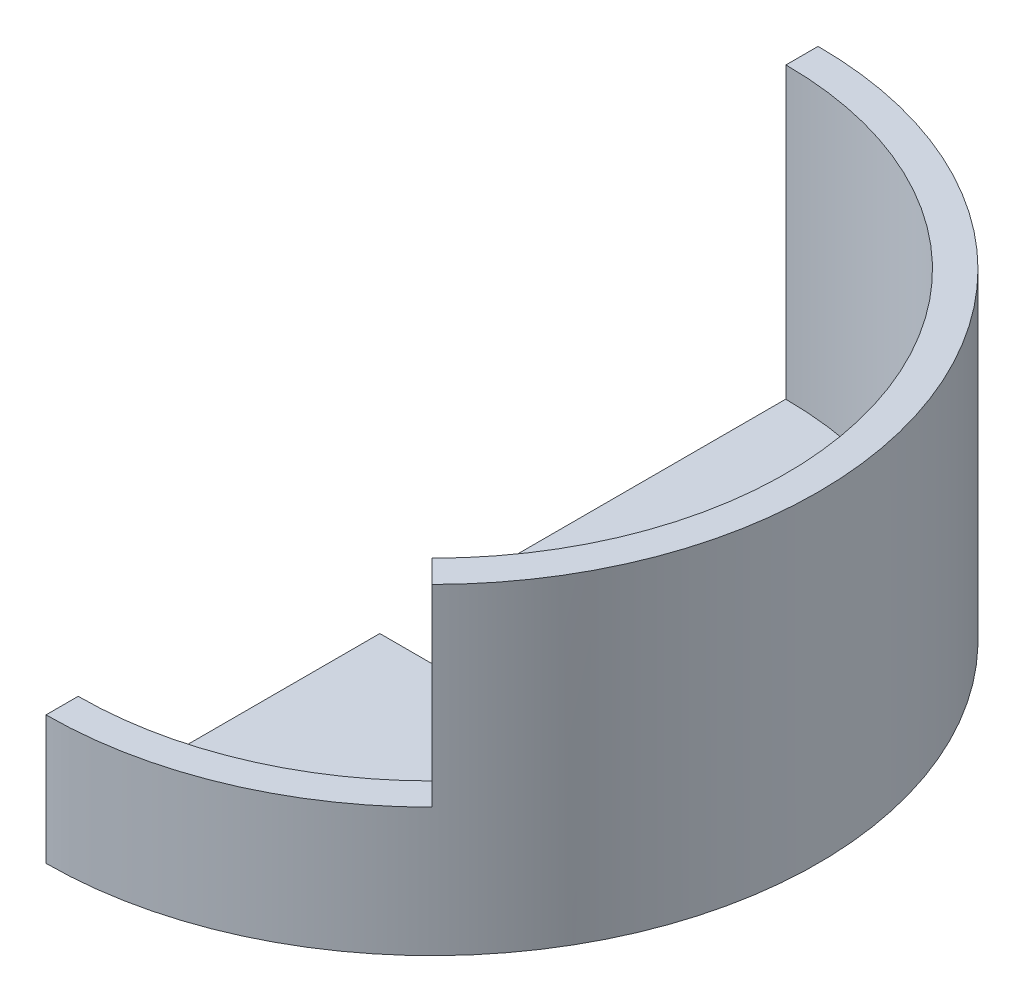
ISO-10303-21;
HEADER;
FILE_DESCRIPTION(('STEP AP214'),'2;1');
FILE_NAME('part.step','',(''),(''),'','','');
FILE_SCHEMA(('AUTOMOTIVE_DESIGN { 1 0 10303 214 1 1 1 1 }'));
ENDSEC;
DATA;
#1=APPLICATION_CONTEXT('core data for automotive mechanical design processes');
#2=APPLICATION_PROTOCOL_DEFINITION('international standard','automotive_design',2000,#1);
#3=PRODUCT_CONTEXT('',#1,'mechanical');
#4=PRODUCT('Part','Part','',(#3));
#5=PRODUCT_RELATED_PRODUCT_CATEGORY('part','',(#4));
#6=PRODUCT_DEFINITION_FORMATION('','',#4);
#7=PRODUCT_DEFINITION_CONTEXT('part definition',#1,'design');
#8=PRODUCT_DEFINITION('design','',#6,#7);
#9=PRODUCT_DEFINITION_SHAPE('','',#8);
#10=(LENGTH_UNIT() NAMED_UNIT(*) SI_UNIT(.MILLI.,.METRE.));
#11=(NAMED_UNIT(*) PLANE_ANGLE_UNIT() SI_UNIT($,.RADIAN.));
#12=(NAMED_UNIT(*) SI_UNIT($,.STERADIAN.) SOLID_ANGLE_UNIT());
#13=UNCERTAINTY_MEASURE_WITH_UNIT(LENGTH_MEASURE(1.E-05),#10,'distance_accuracy_value','');
#14=(GEOMETRIC_REPRESENTATION_CONTEXT(3) GLOBAL_UNCERTAINTY_ASSIGNED_CONTEXT((#13)) GLOBAL_UNIT_ASSIGNED_CONTEXT((#10,
#11,#12)) REPRESENTATION_CONTEXT('',''));
#15=CARTESIAN_POINT('',(0.,0.,0.));
#16=DIRECTION('',(0.,0.,1.));
#17=DIRECTION('',(1.,0.,0.));
#18=AXIS2_PLACEMENT_3D('',#15,#16,#17);
#19=CARTESIAN_POINT('',(0.,0.,0.));
#20=DIRECTION('',(1.,0.,0.));
#21=DIRECTION('',(0.,0.,-1.));
#22=AXIS2_PLACEMENT_3D('',#19,#20,#21);
#23=PLANE('',#22);
#24=DIRECTION('',(0.,0.,-1.));
#25=VECTOR('',#24,1.);
#26=CARTESIAN_POINT('',(0.,0.,0.));
#27=LINE('',#26,#25);
#28=CARTESIAN_POINT('',(0.,0.,-20.6375));
#29=VERTEX_POINT('',#28);
#30=CARTESIAN_POINT('',(0.,0.,-139.7));
#31=VERTEX_POINT('',#30);
#32=EDGE_CURVE('E146',#29,#31,#27,.T.);
#33=ORIENTED_EDGE('',*,*,#32,.F.);
#34=DIRECTION('',(0.,-1.,0.));
#35=VECTOR('',#34,1.);
#36=CARTESIAN_POINT('',(0.,12.7,-20.6375));
#37=LINE('',#36,#35);
#38=CARTESIAN_POINT('',(0.,12.7,-20.6375));
#39=VERTEX_POINT('',#38);
#40=EDGE_CURVE('E142',#39,#29,#37,.T.);
#41=ORIENTED_EDGE('',*,*,#40,.F.);
#42=DIRECTION('',(0.,0.,-1.));
#43=VECTOR('',#42,1.);
#44=CARTESIAN_POINT('',(0.,12.7,0.));
#45=LINE('',#44,#43);
#46=CARTESIAN_POINT('',(0.,12.7,-139.7));
#47=VERTEX_POINT('',#46);
#48=EDGE_CURVE('E62',#39,#47,#45,.T.);
#49=ORIENTED_EDGE('',*,*,#48,.T.);
#50=DIRECTION('',(0.,-1.,0.));
#51=VECTOR('',#50,1.);
#52=CARTESIAN_POINT('',(0.,12.7,-139.7));
#53=LINE('',#52,#51);
#54=EDGE_CURVE('E57',#31,#47,#53,.F.);
#55=ORIENTED_EDGE('',*,*,#54,.F.);
#56=EDGE_LOOP('',(#33,#41,#49,#55));
#57=FACE_BOUND('',#56,.T.);
#58=ADVANCED_FACE('F54',(#57),#23,.F.);
#59=CARTESIAN_POINT('',(0.,12.7,139.7));
#60=VERTEX_POINT('',#59);
#61=CARTESIAN_POINT('',(0.,12.7,20.6375));
#62=VERTEX_POINT('',#61);
#63=EDGE_CURVE('E148',#60,#62,#45,.T.);
#64=ORIENTED_EDGE('',*,*,#63,.T.);
#65=DIRECTION('',(0.,-1.,0.));
#66=VECTOR('',#65,1.);
#67=CARTESIAN_POINT('',(0.,12.7,20.6375));
#68=LINE('',#67,#66);
#69=CARTESIAN_POINT('',(0.,0.,20.6375));
#70=VERTEX_POINT('',#69);
#71=EDGE_CURVE('E12',#62,#70,#68,.T.);
#72=ORIENTED_EDGE('',*,*,#71,.T.);
#73=CARTESIAN_POINT('',(0.,0.,139.7));
#74=VERTEX_POINT('',#73);
#75=EDGE_CURVE('E70',#74,#70,#27,.T.);
#76=ORIENTED_EDGE('',*,*,#75,.F.);
#77=DIRECTION('',(0.,-1.,0.));
#78=VECTOR('',#77,1.);
#79=CARTESIAN_POINT('',(0.,12.7,139.7));
#80=LINE('',#79,#78);
#81=EDGE_CURVE('E149',#60,#74,#80,.T.);
#82=ORIENTED_EDGE('',*,*,#81,.F.);
#83=EDGE_LOOP('',(#64,#72,#76,#82));
#84=FACE_BOUND('',#83,.T.);
#85=ADVANCED_FACE('F158',(#84),#23,.F.);
#86=CARTESIAN_POINT('',(0.,12.7,0.));
#87=DIRECTION('',(0.,-1.,0.));
#88=DIRECTION('',(0.,0.,-1.));
#89=AXIS2_PLACEMENT_3D('',#86,#87,#88);
#90=CYLINDRICAL_SURFACE('',#89,139.7);
#91=CARTESIAN_POINT('',(0.,12.7,0.));
#92=DIRECTION('',(0.,1.,0.));
#93=DIRECTION('',(0.,0.,1.));
#94=AXIS2_PLACEMENT_3D('',#91,#92,#93);
#95=CIRCLE('',#94,139.7);
#96=EDGE_CURVE('E140',#60,#47,#95,.T.);
#97=ORIENTED_EDGE('',*,*,#96,.F.);
#98=ORIENTED_EDGE('',*,*,#81,.T.);
#99=CARTESIAN_POINT('',(0.,0.,0.));
#100=DIRECTION('',(0.,1.,0.));
#101=DIRECTION('',(0.,0.,1.));
#102=AXIS2_PLACEMENT_3D('',#99,#100,#101);
#103=CIRCLE('',#102,139.7);
#104=EDGE_CURVE('E135',#74,#31,#103,.T.);
#105=ORIENTED_EDGE('',*,*,#104,.T.);
#106=ORIENTED_EDGE('',*,*,#54,.T.);
#107=EDGE_LOOP('',(#97,#98,#105,#106));
#108=FACE_BOUND('',#107,.T.);
#109=ADVANCED_FACE('F156',(#108),#90,.T.);
#110=CARTESIAN_POINT('',(0.,12.7,0.));
#111=DIRECTION('',(0.,1.,0.));
#112=DIRECTION('',(0.,0.,1.));
#113=AXIS2_PLACEMENT_3D('',#110,#111,#112);
#114=PLANE('',#113);
#115=ORIENTED_EDGE('',*,*,#63,.F.);
#116=ORIENTED_EDGE('',*,*,#96,.T.);
#117=ORIENTED_EDGE('',*,*,#48,.F.);
#118=DIRECTION('',(1.,0.,0.));
#119=VECTOR('',#118,1.);
#120=CARTESIAN_POINT('',(-20.6375,12.7,-20.6375));
#121=LINE('',#120,#119);
#122=CARTESIAN_POINT('',(20.6375,12.7,-20.6375));
#123=VERTEX_POINT('',#122);
#124=EDGE_CURVE('E107',#39,#123,#121,.T.);
#125=ORIENTED_EDGE('',*,*,#124,.T.);
#126=DIRECTION('',(0.,0.,-1.));
#127=VECTOR('',#126,1.);
#128=CARTESIAN_POINT('',(20.6375,12.7,20.6375));
#129=LINE('',#128,#127);
#130=CARTESIAN_POINT('',(20.6375,12.7,20.6375));
#131=VERTEX_POINT('',#130);
#132=EDGE_CURVE('E112',#131,#123,#129,.T.);
#133=ORIENTED_EDGE('',*,*,#132,.F.);
#134=DIRECTION('',(1.,0.,0.));
#135=VECTOR('',#134,1.);
#136=CARTESIAN_POINT('',(-20.6375,12.7,20.6375));
#137=LINE('',#136,#135);
#138=EDGE_CURVE('E129',#62,#131,#137,.T.);
#139=ORIENTED_EDGE('',*,*,#138,.F.);
#140=EDGE_LOOP('',(#115,#116,#117,#125,#133,#139));
#141=FACE_BOUND('',#140,.T.);
#142=ADVANCED_FACE('F110',(#141),#114,.T.);
#143=CARTESIAN_POINT('',(0.,0.,0.));
#144=DIRECTION('',(0.,1.,0.));
#145=DIRECTION('',(0.,0.,1.));
#146=AXIS2_PLACEMENT_3D('',#143,#144,#145);
#147=PLANE('',#146);
#148=ORIENTED_EDGE('',*,*,#104,.F.);
#149=ORIENTED_EDGE('',*,*,#75,.T.);
#150=DIRECTION('',(1.,0.,0.));
#151=VECTOR('',#150,1.);
#152=CARTESIAN_POINT('',(-20.6375,0.,20.6375));
#153=LINE('',#152,#151);
#154=CARTESIAN_POINT('',(20.6375,0.,20.6375));
#155=VERTEX_POINT('',#154);
#156=EDGE_CURVE('E118',#70,#155,#153,.T.);
#157=ORIENTED_EDGE('',*,*,#156,.T.);
#158=DIRECTION('',(0.,0.,-1.));
#159=VECTOR('',#158,1.);
#160=CARTESIAN_POINT('',(20.6375,0.,20.6375));
#161=LINE('',#160,#159);
#162=CARTESIAN_POINT('',(20.6375,0.,-20.6375));
#163=VERTEX_POINT('',#162);
#164=EDGE_CURVE('E160',#155,#163,#161,.T.);
#165=ORIENTED_EDGE('',*,*,#164,.T.);
#166=DIRECTION('',(1.,0.,0.));
#167=VECTOR('',#166,1.);
#168=CARTESIAN_POINT('',(-20.6375,0.,-20.6375));
#169=LINE('',#168,#167);
#170=EDGE_CURVE('E133',#29,#163,#169,.T.);
#171=ORIENTED_EDGE('',*,*,#170,.F.);
#172=ORIENTED_EDGE('',*,*,#32,.T.);
#173=EDGE_LOOP('',(#148,#149,#157,#165,#171,#172));
#174=FACE_BOUND('',#173,.T.);
#175=ADVANCED_FACE('F152',(#174),#147,.F.);
#176=CARTESIAN_POINT('',(-20.6375,12.7,-20.6375));
#177=DIRECTION('',(0.,0.,-1.));
#178=DIRECTION('',(-1.,0.,0.));
#179=AXIS2_PLACEMENT_3D('',#176,#177,#178);
#180=PLANE('',#179);
#181=ORIENTED_EDGE('',*,*,#124,.F.);
#182=ORIENTED_EDGE('',*,*,#40,.T.);
#183=ORIENTED_EDGE('',*,*,#170,.T.);
#184=DIRECTION('',(0.,-1.,0.));
#185=VECTOR('',#184,1.);
#186=CARTESIAN_POINT('',(20.6375,12.7,-20.6375));
#187=LINE('',#186,#185);
#188=EDGE_CURVE('E125',#123,#163,#187,.T.);
#189=ORIENTED_EDGE('',*,*,#188,.F.);
#190=EDGE_LOOP('',(#181,#182,#183,#189));
#191=FACE_BOUND('',#190,.T.);
#192=ADVANCED_FACE('F131',(#191),#180,.F.);
#193=CARTESIAN_POINT('',(-20.6375,12.7,20.6375));
#194=DIRECTION('',(0.,0.,-1.));
#195=DIRECTION('',(-1.,0.,0.));
#196=AXIS2_PLACEMENT_3D('',#193,#194,#195);
#197=PLANE('',#196);
#198=ORIENTED_EDGE('',*,*,#71,.F.);
#199=ORIENTED_EDGE('',*,*,#138,.T.);
#200=DIRECTION('',(0.,-1.,0.));
#201=VECTOR('',#200,1.);
#202=CARTESIAN_POINT('',(20.6375,12.7,20.6375));
#203=LINE('',#202,#201);
#204=EDGE_CURVE('E128',#131,#155,#203,.T.);
#205=ORIENTED_EDGE('',*,*,#204,.T.);
#206=ORIENTED_EDGE('',*,*,#156,.F.);
#207=EDGE_LOOP('',(#198,#199,#205,#206));
#208=FACE_BOUND('',#207,.T.);
#209=ADVANCED_FACE('F159',(#208),#197,.T.);
#210=CARTESIAN_POINT('',(20.6375,12.7,20.6375));
#211=DIRECTION('',(-1.,0.,0.));
#212=DIRECTION('',(0.,0.,1.));
#213=AXIS2_PLACEMENT_3D('',#210,#211,#212);
#214=PLANE('',#213);
#215=ORIENTED_EDGE('',*,*,#164,.F.);
#216=ORIENTED_EDGE('',*,*,#204,.F.);
#217=ORIENTED_EDGE('',*,*,#132,.T.);
#218=ORIENTED_EDGE('',*,*,#188,.T.);
#219=EDGE_LOOP('',(#215,#216,#217,#218));
#220=FACE_BOUND('',#219,.T.);
#221=ADVANCED_FACE('F124',(#220),#214,.T.);
#222=CLOSED_SHELL('',(#58,#85,#109,#142,#175,#192,#209,#221));
#223=MANIFOLD_SOLID_BREP('B2',#222);
#224=CARTESIAN_POINT('',(0.,0.,0.));
#225=DIRECTION('',(1.,0.,0.));
#226=DIRECTION('',(0.,0.,-1.));
#227=AXIS2_PLACEMENT_3D('',#224,#225,#226);
#228=PLANE('',#227);
#229=DIRECTION('',(0.,0.,-1.));
#230=VECTOR('',#229,1.);
#231=CARTESIAN_POINT('',(0.,0.,107.830177644923));
#232=LINE('',#231,#230);
#233=CARTESIAN_POINT('',(0.,0.,152.494899658551));
#234=VERTEX_POINT('',#233);
#235=CARTESIAN_POINT('',(0.,0.,139.794899658551));
#236=VERTEX_POINT('',#235);
#237=EDGE_CURVE('E333',#234,#236,#232,.T.);
#238=ORIENTED_EDGE('',*,*,#237,.F.);
#239=DIRECTION('',(0.,-1.,0.));
#240=VECTOR('',#239,1.);
#241=CARTESIAN_POINT('',(0.,0.,152.494899658551));
#242=LINE('',#241,#240);
#243=CARTESIAN_POINT('',(0.,50.8,152.494899658551));
#244=VERTEX_POINT('',#243);
#245=EDGE_CURVE('E332',#234,#244,#242,.F.);
#246=ORIENTED_EDGE('',*,*,#245,.T.);
#247=DIRECTION('',(0.,0.,-1.));
#248=VECTOR('',#247,1.);
#249=CARTESIAN_POINT('',(0.,50.8,107.830177644923));
#250=LINE('',#249,#248);
#251=CARTESIAN_POINT('',(0.,50.8,139.794899658551));
#252=VERTEX_POINT('',#251);
#253=EDGE_CURVE('E235',#244,#252,#250,.T.);
#254=ORIENTED_EDGE('',*,*,#253,.T.);
#255=DIRECTION('',(0.,-1.,0.));
#256=VECTOR('',#255,1.);
#257=CARTESIAN_POINT('',(0.,0.,139.794899658551));
#258=LINE('',#257,#256);
#259=EDGE_CURVE('E229',#236,#252,#258,.F.);
#260=ORIENTED_EDGE('',*,*,#259,.F.);
#261=EDGE_LOOP('',(#238,#246,#254,#260));
#262=FACE_BOUND('',#261,.T.);
#263=ADVANCED_FACE('F226',(#262),#228,.F.);
#264=DIRECTION('',(0.,0.,-1.));
#265=VECTOR('',#264,1.);
#266=CARTESIAN_POINT('',(0.,127.,107.830177644925));
#267=LINE('',#266,#265);
#268=CARTESIAN_POINT('',(0.,127.,-139.794899658551));
#269=VERTEX_POINT('',#268);
#270=CARTESIAN_POINT('',(0.,127.,-152.494899658551));
#271=VERTEX_POINT('',#270);
#272=EDGE_CURVE('E52',#269,#271,#267,.T.);
#273=ORIENTED_EDGE('',*,*,#272,.T.);
#274=DIRECTION('',(0.,-1.,0.));
#275=VECTOR('',#274,1.);
#276=CARTESIAN_POINT('',(0.,0.,-152.494899658551));
#277=LINE('',#276,#275);
#278=CARTESIAN_POINT('',(0.,0.,-152.494899658551));
#279=VERTEX_POINT('',#278);
#280=EDGE_CURVE('E243',#271,#279,#277,.T.);
#281=ORIENTED_EDGE('',*,*,#280,.T.);
#282=CARTESIAN_POINT('',(0.,0.,-139.794899658551));
#283=VERTEX_POINT('',#282);
#284=EDGE_CURVE('E328',#283,#279,#232,.T.);
#285=ORIENTED_EDGE('',*,*,#284,.F.);
#286=DIRECTION('',(0.,-1.,0.));
#287=VECTOR('',#286,1.);
#288=CARTESIAN_POINT('',(0.,0.,-139.794899658551));
#289=LINE('',#288,#287);
#290=EDGE_CURVE('E249',#269,#283,#289,.T.);
#291=ORIENTED_EDGE('',*,*,#290,.F.);
#292=EDGE_LOOP('',(#273,#281,#285,#291));
#293=FACE_BOUND('',#292,.T.);
#294=ADVANCED_FACE('F353',(#293),#228,.F.);
#295=CARTESIAN_POINT('',(0.,0.,0.));
#296=DIRECTION('',(0.,-1.,0.));
#297=DIRECTION('',(0.,0.,-1.));
#298=AXIS2_PLACEMENT_3D('',#295,#296,#297);
#299=CYLINDRICAL_SURFACE('',#298,139.794899658551);
#300=CARTESIAN_POINT('',(0.,0.,0.));
#301=DIRECTION('',(0.,-1.,0.));
#302=DIRECTION('',(0.,0.,-1.));
#303=AXIS2_PLACEMENT_3D('',#300,#301,#302);
#304=CIRCLE('',#303,139.794899658551);
#305=EDGE_CURVE('E326',#283,#236,#304,.T.);
#306=ORIENTED_EDGE('',*,*,#305,.T.);
#307=ORIENTED_EDGE('',*,*,#259,.T.);
#308=CARTESIAN_POINT('',(0.,50.8,0.));
#309=DIRECTION('',(0.,-1.,0.));
#310=DIRECTION('',(0.,0.,-1.));
#311=AXIS2_PLACEMENT_3D('',#308,#309,#310);
#312=CIRCLE('',#311,139.794899658551);
#313=CARTESIAN_POINT('',(98.8499215238542,50.8,98.8499215238541));
#314=VERTEX_POINT('',#313);
#315=EDGE_CURVE('E297',#314,#252,#312,.T.);
#316=ORIENTED_EDGE('',*,*,#315,.F.);
#317=DIRECTION('',(0.,1.,0.));
#318=VECTOR('',#317,1.);
#319=CARTESIAN_POINT('',(98.8499215238542,0.,98.8499215238542));
#320=LINE('',#319,#318);
#321=CARTESIAN_POINT('',(98.8499215238541,127.,98.8499215238542));
#322=VERTEX_POINT('',#321);
#323=EDGE_CURVE('E293',#314,#322,#320,.T.);
#324=ORIENTED_EDGE('',*,*,#323,.T.);
#325=CARTESIAN_POINT('',(0.,127.,0.));
#326=DIRECTION('',(0.,-1.,0.));
#327=DIRECTION('',(0.,0.,-1.));
#328=AXIS2_PLACEMENT_3D('',#325,#326,#327);
#329=CIRCLE('',#328,139.794899658551);
#330=EDGE_CURVE('E281',#269,#322,#329,.T.);
#331=ORIENTED_EDGE('',*,*,#330,.F.);
#332=ORIENTED_EDGE('',*,*,#290,.T.);
#333=EDGE_LOOP('',(#306,#307,#316,#324,#331,#332));
#334=FACE_BOUND('',#333,.T.);
#335=ADVANCED_FACE('F295',(#334),#299,.F.);
#336=CARTESIAN_POINT('',(107.830177644923,0.,107.830177644923));
#337=DIRECTION('',(0.,1.,0.));
#338=DIRECTION('',(0.,0.,1.));
#339=AXIS2_PLACEMENT_3D('',#336,#337,#338);
#340=PLANE('',#339);
#341=CARTESIAN_POINT('',(0.,0.,0.));
#342=DIRECTION('',(0.,-1.,0.));
#343=DIRECTION('',(0.,0.,-1.));
#344=AXIS2_PLACEMENT_3D('',#341,#342,#343);
#345=CIRCLE('',#344,152.494899658551);
#346=EDGE_CURVE('E322',#279,#234,#345,.T.);
#347=ORIENTED_EDGE('',*,*,#346,.T.);
#348=ORIENTED_EDGE('',*,*,#237,.T.);
#349=ORIENTED_EDGE('',*,*,#305,.F.);
#350=ORIENTED_EDGE('',*,*,#284,.T.);
#351=EDGE_LOOP('',(#347,#348,#349,#350));
#352=FACE_BOUND('',#351,.T.);
#353=ADVANCED_FACE('F351',(#352),#340,.F.);
#354=CARTESIAN_POINT('',(0.,0.,0.));
#355=DIRECTION('',(0.,-1.,0.));
#356=DIRECTION('',(0.,0.,-1.));
#357=AXIS2_PLACEMENT_3D('',#354,#355,#356);
#358=CYLINDRICAL_SURFACE('',#357,152.494899658551);
#359=ORIENTED_EDGE('',*,*,#245,.F.);
#360=ORIENTED_EDGE('',*,*,#346,.F.);
#361=ORIENTED_EDGE('',*,*,#280,.F.);
#362=CARTESIAN_POINT('',(0.,127.,0.));
#363=DIRECTION('',(0.,-1.,0.));
#364=DIRECTION('',(0.,0.,-1.));
#365=AXIS2_PLACEMENT_3D('',#362,#363,#364);
#366=CIRCLE('',#365,152.494899658551);
#367=CARTESIAN_POINT('',(107.830177644923,127.,107.830177644923));
#368=VERTEX_POINT('',#367);
#369=EDGE_CURVE('E290',#271,#368,#366,.T.);
#370=ORIENTED_EDGE('',*,*,#369,.T.);
#371=DIRECTION('',(0.,1.,0.));
#372=VECTOR('',#371,1.);
#373=CARTESIAN_POINT('',(107.830177644923,0.,107.830177644923));
#374=LINE('',#373,#372);
#375=CARTESIAN_POINT('',(107.830177644923,50.8,107.830177644923));
#376=VERTEX_POINT('',#375);
#377=EDGE_CURVE('E306',#376,#368,#374,.T.);
#378=ORIENTED_EDGE('',*,*,#377,.F.);
#379=CARTESIAN_POINT('',(0.,50.8,0.));
#380=DIRECTION('',(0.,-1.,0.));
#381=DIRECTION('',(0.,0.,-1.));
#382=AXIS2_PLACEMENT_3D('',#379,#380,#381);
#383=CIRCLE('',#382,152.494899658551);
#384=EDGE_CURVE('E318',#376,#244,#383,.T.);
#385=ORIENTED_EDGE('',*,*,#384,.T.);
#386=EDGE_LOOP('',(#359,#360,#361,#370,#378,#385));
#387=FACE_BOUND('',#386,.T.);
#388=ADVANCED_FACE('F349',(#387),#358,.T.);
#389=CARTESIAN_POINT('',(107.830177644923,50.8,107.830177644923));
#390=DIRECTION('',(0.,1.,0.));
#391=DIRECTION('',(0.,0.,1.));
#392=AXIS2_PLACEMENT_3D('',#389,#390,#391);
#393=PLANE('',#392);
#394=ORIENTED_EDGE('',*,*,#253,.F.);
#395=ORIENTED_EDGE('',*,*,#384,.F.);
#396=DIRECTION('',(-0.707106781186548,0.,-0.707106781186548));
#397=VECTOR('',#396,1.);
#398=CARTESIAN_POINT('',(107.830177644923,50.8,107.830177644923));
#399=LINE('',#398,#397);
#400=EDGE_CURVE('E289',#376,#314,#399,.T.);
#401=ORIENTED_EDGE('',*,*,#400,.T.);
#402=ORIENTED_EDGE('',*,*,#315,.T.);
#403=EDGE_LOOP('',(#394,#395,#401,#402));
#404=FACE_BOUND('',#403,.T.);
#405=ADVANCED_FACE('F348',(#404),#393,.T.);
#406=CARTESIAN_POINT('',(-107.830177644922,127.,107.830177644925));
#407=DIRECTION('',(0.,1.,0.));
#408=DIRECTION('',(0.,0.,1.));
#409=AXIS2_PLACEMENT_3D('',#406,#407,#408);
#410=PLANE('',#409);
#411=ORIENTED_EDGE('',*,*,#272,.F.);
#412=ORIENTED_EDGE('',*,*,#330,.T.);
#413=DIRECTION('',(-0.707106781186548,0.,-0.707106781186548));
#414=VECTOR('',#413,1.);
#415=CARTESIAN_POINT('',(107.830177644923,127.,107.830177644923));
#416=LINE('',#415,#414);
#417=EDGE_CURVE('E286',#368,#322,#416,.T.);
#418=ORIENTED_EDGE('',*,*,#417,.F.);
#419=ORIENTED_EDGE('',*,*,#369,.F.);
#420=EDGE_LOOP('',(#411,#412,#418,#419));
#421=FACE_BOUND('',#420,.T.);
#422=ADVANCED_FACE('F283',(#421),#410,.T.);
#423=CARTESIAN_POINT('',(0.,0.,0.));
#424=DIRECTION('',(-0.707106781186548,0.,0.707106781186548));
#425=DIRECTION('',(0.707106781186548,0.,0.707106781186548));
#426=AXIS2_PLACEMENT_3D('',#423,#424,#425);
#427=PLANE('',#426);
#428=ORIENTED_EDGE('',*,*,#323,.F.);
#429=ORIENTED_EDGE('',*,*,#400,.F.);
#430=ORIENTED_EDGE('',*,*,#377,.T.);
#431=ORIENTED_EDGE('',*,*,#417,.T.);
#432=EDGE_LOOP('',(#428,#429,#430,#431));
#433=FACE_BOUND('',#432,.T.);
#434=ADVANCED_FACE('F304',(#433),#427,.T.);
#435=CLOSED_SHELL('',(#263,#294,#335,#353,#388,#405,#422,#434));
#436=MANIFOLD_SOLID_BREP('B6',#435);
#437=ADVANCED_BREP_SHAPE_REPRESENTATION('',(#18,#223,#436),#14);
#438=SHAPE_DEFINITION_REPRESENTATION(#9,#437);
ENDSEC;
END-ISO-10303-21;
